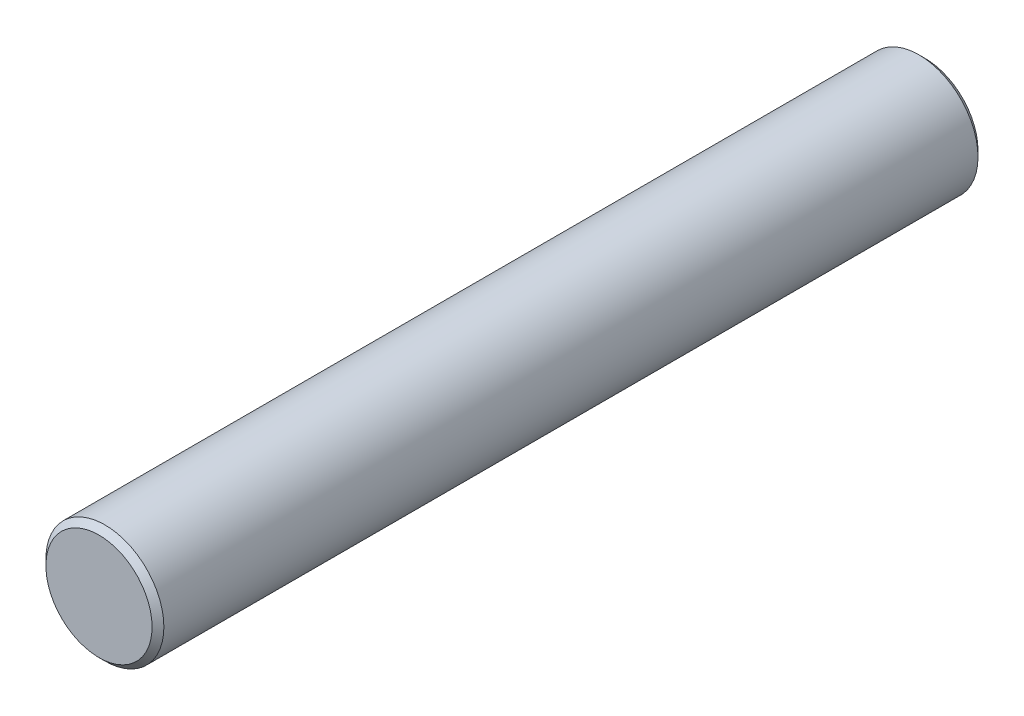
ISO-10303-21;
HEADER;
FILE_DESCRIPTION(('STEP AP214'),'2;1');
FILE_NAME('part.step','',(''),(''),'','','');
FILE_SCHEMA(('AUTOMOTIVE_DESIGN { 1 0 10303 214 1 1 1 1 }'));
ENDSEC;
DATA;
#1=APPLICATION_CONTEXT('core data for automotive mechanical design processes');
#2=APPLICATION_PROTOCOL_DEFINITION('international standard','automotive_design',2000,#1);
#3=PRODUCT_CONTEXT('',#1,'mechanical');
#4=PRODUCT('Part','Part','',(#3));
#5=PRODUCT_RELATED_PRODUCT_CATEGORY('part','',(#4));
#6=PRODUCT_DEFINITION_FORMATION('','',#4);
#7=PRODUCT_DEFINITION_CONTEXT('part definition',#1,'design');
#8=PRODUCT_DEFINITION('design','',#6,#7);
#9=PRODUCT_DEFINITION_SHAPE('','',#8);
#10=(LENGTH_UNIT() NAMED_UNIT(*) SI_UNIT(.MILLI.,.METRE.));
#11=(NAMED_UNIT(*) PLANE_ANGLE_UNIT() SI_UNIT($,.RADIAN.));
#12=(NAMED_UNIT(*) SI_UNIT($,.STERADIAN.) SOLID_ANGLE_UNIT());
#13=UNCERTAINTY_MEASURE_WITH_UNIT(LENGTH_MEASURE(1.E-05),#10,'distance_accuracy_value','');
#14=(GEOMETRIC_REPRESENTATION_CONTEXT(3) GLOBAL_UNCERTAINTY_ASSIGNED_CONTEXT((#13)) GLOBAL_UNIT_ASSIGNED_CONTEXT((#10,
#11,#12)) REPRESENTATION_CONTEXT('',''));
#15=CARTESIAN_POINT('',(0.,0.,0.));
#16=DIRECTION('',(0.,0.,1.));
#17=DIRECTION('',(1.,0.,0.));
#18=AXIS2_PLACEMENT_3D('',#15,#16,#17);
#19=CARTESIAN_POINT('',(0.,0.,70.));
#20=DIRECTION('',(0.,0.,1.));
#21=DIRECTION('',(1.,0.,0.));
#22=AXIS2_PLACEMENT_3D('',#19,#20,#21);
#23=PLANE('',#22);
#24=CARTESIAN_POINT('',(0.,0.,70.));
#25=DIRECTION('',(0.,0.,-1.));
#26=DIRECTION('',(-1.,0.,0.));
#27=AXIS2_PLACEMENT_3D('',#24,#25,#26);
#28=CIRCLE('',#27,4.5);
#29=CARTESIAN_POINT('',(4.5,0.,70.));
#30=VERTEX_POINT('',#29);
#31=EDGE_CURVE('E11',#30,#30,#28,.T.);
#32=ORIENTED_EDGE('',*,*,#31,.F.);
#33=EDGE_LOOP('',(#32));
#34=FACE_BOUND('',#33,.T.);
#35=ADVANCED_FACE('F16',(#34),#23,.T.);
#36=CARTESIAN_POINT('',(0.,0.,69.75));
#37=DIRECTION('',(0.,0.,-1.));
#38=DIRECTION('',(-1.,0.,0.));
#39=AXIS2_PLACEMENT_3D('',#36,#37,#38);
#40=CONICAL_SURFACE('',#39,4.75,0.785398163400002);
#41=ORIENTED_EDGE('',*,*,#31,.T.);
#42=EDGE_LOOP('',(#41));
#43=FACE_BOUND('',#42,.T.);
#44=CARTESIAN_POINT('',(0.,0.,69.5));
#45=DIRECTION('',(0.,0.,1.));
#46=DIRECTION('',(-1.,0.,0.));
#47=AXIS2_PLACEMENT_3D('',#44,#45,#46);
#48=CIRCLE('',#47,5.);
#49=CARTESIAN_POINT('',(5.,0.,69.5));
#50=VERTEX_POINT('',#49);
#51=EDGE_CURVE('E20',#50,#50,#48,.T.);
#52=ORIENTED_EDGE('',*,*,#51,.T.);
#53=EDGE_LOOP('',(#52));
#54=FACE_BOUND('',#53,.T.);
#55=ADVANCED_FACE('F80',(#43,#54),#40,.T.);
#56=CARTESIAN_POINT('',(0.,0.,0.));
#57=DIRECTION('',(0.,0.,1.));
#58=DIRECTION('',(1.,0.,0.));
#59=AXIS2_PLACEMENT_3D('',#56,#57,#58);
#60=PLANE('',#59);
#61=CARTESIAN_POINT('',(0.,0.,0.));
#62=DIRECTION('',(0.,0.,1.));
#63=DIRECTION('',(-1.,0.,0.));
#64=AXIS2_PLACEMENT_3D('',#61,#62,#63);
#65=CIRCLE('',#64,4.5);
#66=CARTESIAN_POINT('',(4.5,0.,0.));
#67=VERTEX_POINT('',#66);
#68=EDGE_CURVE('E51',#67,#67,#65,.T.);
#69=ORIENTED_EDGE('',*,*,#68,.F.);
#70=EDGE_LOOP('',(#69));
#71=FACE_BOUND('',#70,.T.);
#72=ADVANCED_FACE('F91',(#71),#60,.F.);
#73=CARTESIAN_POINT('',(0.,0.,0.));
#74=DIRECTION('',(0.,0.,1.));
#75=DIRECTION('',(-1.,0.,0.));
#76=AXIS2_PLACEMENT_3D('',#73,#74,#75);
#77=CYLINDRICAL_SURFACE('',#76,5.);
#78=CARTESIAN_POINT('',(0.,0.,0.5));
#79=DIRECTION('',(0.,0.,-1.));
#80=DIRECTION('',(-1.,0.,0.));
#81=AXIS2_PLACEMENT_3D('',#78,#79,#80);
#82=CIRCLE('',#81,5.);
#83=CARTESIAN_POINT('',(5.,0.,0.5));
#84=VERTEX_POINT('',#83);
#85=EDGE_CURVE('E44',#84,#84,#82,.T.);
#86=ORIENTED_EDGE('',*,*,#85,.F.);
#87=EDGE_LOOP('',(#86));
#88=FACE_BOUND('',#87,.T.);
#89=ORIENTED_EDGE('',*,*,#51,.F.);
#90=EDGE_LOOP('',(#89));
#91=FACE_BOUND('',#90,.T.);
#92=ADVANCED_FACE('F86',(#88,#91),#77,.T.);
#93=CARTESIAN_POINT('',(0.,0.,0.25));
#94=DIRECTION('',(0.,0.,1.));
#95=DIRECTION('',(-1.,0.,0.));
#96=AXIS2_PLACEMENT_3D('',#93,#94,#95);
#97=CONICAL_SURFACE('',#96,4.75,0.7853981634);
#98=ORIENTED_EDGE('',*,*,#68,.T.);
#99=EDGE_LOOP('',(#98));
#100=FACE_BOUND('',#99,.T.);
#101=ORIENTED_EDGE('',*,*,#85,.T.);
#102=EDGE_LOOP('',(#101));
#103=FACE_BOUND('',#102,.T.);
#104=ADVANCED_FACE('F18',(#100,#103),#97,.T.);
#105=CLOSED_SHELL('',(#35,#55,#72,#92,#104));
#106=MANIFOLD_SOLID_BREP('B1',#105);
#107=ADVANCED_BREP_SHAPE_REPRESENTATION('',(#18,#106),#14);
#108=SHAPE_DEFINITION_REPRESENTATION(#9,#107);
ENDSEC;
END-ISO-10303-21;
